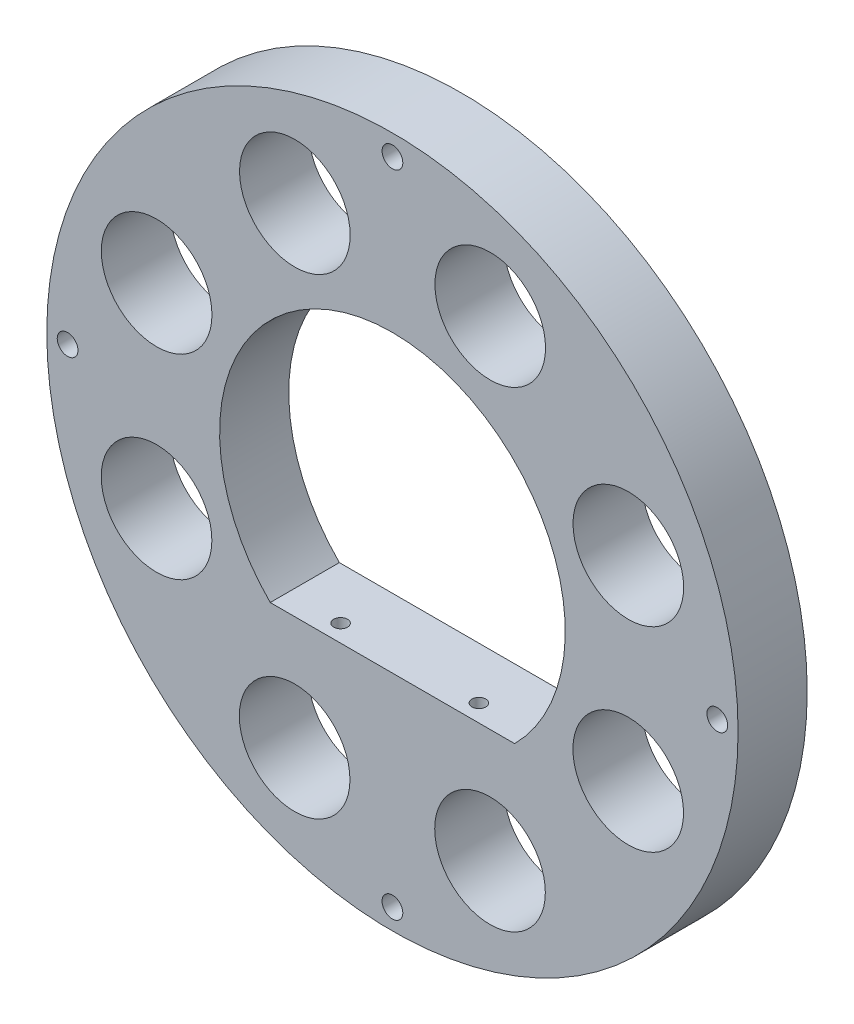
ISO-10303-21;
HEADER;
FILE_DESCRIPTION(('STEP AP214'),'2;1');
FILE_NAME('part.step','',(''),(''),'','','');
FILE_SCHEMA(('AUTOMOTIVE_DESIGN { 1 0 10303 214 1 1 1 1 }'));
ENDSEC;
DATA;
#1=APPLICATION_CONTEXT('core data for automotive mechanical design processes');
#2=APPLICATION_PROTOCOL_DEFINITION('international standard','automotive_design',2000,#1);
#3=PRODUCT_CONTEXT('',#1,'mechanical');
#4=PRODUCT('Part','Part','',(#3));
#5=PRODUCT_RELATED_PRODUCT_CATEGORY('part','',(#4));
#6=PRODUCT_DEFINITION_FORMATION('','',#4);
#7=PRODUCT_DEFINITION_CONTEXT('part definition',#1,'design');
#8=PRODUCT_DEFINITION('design','',#6,#7);
#9=PRODUCT_DEFINITION_SHAPE('','',#8);
#10=(LENGTH_UNIT() NAMED_UNIT(*) SI_UNIT(.MILLI.,.METRE.));
#11=(NAMED_UNIT(*) PLANE_ANGLE_UNIT() SI_UNIT($,.RADIAN.));
#12=(NAMED_UNIT(*) SI_UNIT($,.STERADIAN.) SOLID_ANGLE_UNIT());
#13=UNCERTAINTY_MEASURE_WITH_UNIT(LENGTH_MEASURE(1.E-05),#10,'distance_accuracy_value','');
#14=(GEOMETRIC_REPRESENTATION_CONTEXT(3) GLOBAL_UNCERTAINTY_ASSIGNED_CONTEXT((#13)) GLOBAL_UNIT_ASSIGNED_CONTEXT((#10,
#11,#12)) REPRESENTATION_CONTEXT('',''));
#15=CARTESIAN_POINT('',(0.,0.,0.));
#16=DIRECTION('',(0.,0.,1.));
#17=DIRECTION('',(1.,0.,0.));
#18=AXIS2_PLACEMENT_3D('',#15,#16,#17);
#19=CARTESIAN_POINT('',(0.,0.,10.));
#20=DIRECTION('',(0.,0.,1.));
#21=DIRECTION('',(1.,0.,0.));
#22=AXIS2_PLACEMENT_3D('',#19,#20,#21);
#23=PLANE('',#22);
#24=CARTESIAN_POINT('',(0.,46.99,10.));
#25=DIRECTION('',(0.,0.,1.));
#26=DIRECTION('',(1.,0.,0.));
#27=AXIS2_PLACEMENT_3D('',#24,#25,#26);
#28=CIRCLE('',#27,1.5);
#29=CARTESIAN_POINT('',(1.5,46.99,10.));
#30=VERTEX_POINT('',#29);
#31=EDGE_CURVE('E203',#30,#30,#28,.T.);
#32=ORIENTED_EDGE('',*,*,#31,.F.);
#33=EDGE_LOOP('',(#32));
#34=FACE_BOUND('',#33,.T.);
#35=CARTESIAN_POINT('',(-46.9900000000013,1.32978151082549E-12,10.));
#36=DIRECTION('',(0.,0.,1.));
#37=DIRECTION('',(1.,0.,0.));
#38=AXIS2_PLACEMENT_3D('',#35,#36,#37);
#39=CIRCLE('',#38,1.50000000000104);
#40=CARTESIAN_POINT('',(-45.4900000000003,1.32978151082549E-12,10.));
#41=VERTEX_POINT('',#40);
#42=EDGE_CURVE('E426',#41,#41,#39,.T.);
#43=ORIENTED_EDGE('',*,*,#42,.F.);
#44=EDGE_LOOP('',(#43));
#45=FACE_BOUND('',#44,.T.);
#46=CARTESIAN_POINT('',(-2.65956302165098E-12,-46.99,10.));
#47=DIRECTION('',(0.,0.,1.));
#48=DIRECTION('',(1.,0.,0.));
#49=AXIS2_PLACEMENT_3D('',#46,#47,#48);
#50=CIRCLE('',#49,1.50000000000286);
#51=CARTESIAN_POINT('',(1.5000000000002,-46.99,10.));
#52=VERTEX_POINT('',#51);
#53=EDGE_CURVE('E422',#52,#52,#50,.T.);
#54=ORIENTED_EDGE('',*,*,#53,.F.);
#55=EDGE_LOOP('',(#54));
#56=FACE_BOUND('',#55,.T.);
#57=CARTESIAN_POINT('',(46.9899999999987,-1.33553612613468E-12,10.));
#58=DIRECTION('',(0.,0.,1.));
#59=DIRECTION('',(1.,0.,0.));
#60=AXIS2_PLACEMENT_3D('',#57,#58,#59);
#61=CIRCLE('',#60,1.50000000000214);
#62=CARTESIAN_POINT('',(48.4900000000008,-1.33553612613468E-12,10.));
#63=VERTEX_POINT('',#62);
#64=EDGE_CURVE('E411',#63,#63,#61,.T.);
#65=ORIENTED_EDGE('',*,*,#64,.F.);
#66=EDGE_LOOP('',(#65));
#67=FACE_BOUND('',#66,.T.);
#68=CARTESIAN_POINT('',(34.1220261165839,14.1160551629816,10.));
#69=DIRECTION('',(0.,0.,1.));
#70=DIRECTION('',(1.,0.,0.));
#71=AXIS2_PLACEMENT_3D('',#68,#69,#70);
#72=CIRCLE('',#71,8.00000000000001);
#73=CARTESIAN_POINT('',(42.1220261165839,14.1160551629816,10.));
#74=VERTEX_POINT('',#73);
#75=EDGE_CURVE('E238',#74,#74,#72,.T.);
#76=ORIENTED_EDGE('',*,*,#75,.F.);
#77=EDGE_LOOP('',(#76));
#78=FACE_BOUND('',#77,.T.);
#79=CARTESIAN_POINT('',(34.1094743842074,-14.1463577255162,10.));
#80=DIRECTION('',(0.,0.,1.));
#81=DIRECTION('',(1.,0.,0.));
#82=AXIS2_PLACEMENT_3D('',#79,#80,#81);
#83=CIRCLE('',#82,8.);
#84=CARTESIAN_POINT('',(42.1094743842074,-14.1463577255162,10.));
#85=VERTEX_POINT('',#84);
#86=EDGE_CURVE('E188',#85,#85,#83,.T.);
#87=ORIENTED_EDGE('',*,*,#86,.F.);
#88=EDGE_LOOP('',(#87));
#89=FACE_BOUND('',#88,.T.);
#90=CARTESIAN_POINT('',(14.1160551629774,-34.1220261165881,10.));
#91=DIRECTION('',(0.,0.,1.));
#92=DIRECTION('',(1.,0.,0.));
#93=AXIS2_PLACEMENT_3D('',#90,#91,#92);
#94=CIRCLE('',#93,8.);
#95=CARTESIAN_POINT('',(22.1160551629774,-34.1220261165881,10.));
#96=VERTEX_POINT('',#95);
#97=EDGE_CURVE('E232',#96,#96,#94,.T.);
#98=ORIENTED_EDGE('',*,*,#97,.F.);
#99=EDGE_LOOP('',(#98));
#100=FACE_BOUND('',#99,.T.);
#101=CARTESIAN_POINT('',(-14.1463577255204,-34.1094743842116,10.));
#102=DIRECTION('',(0.,0.,1.));
#103=DIRECTION('',(1.,0.,0.));
#104=AXIS2_PLACEMENT_3D('',#101,#102,#103);
#105=CIRCLE('',#104,8.);
#106=CARTESIAN_POINT('',(-6.14635772552045,-34.1094743842116,10.));
#107=VERTEX_POINT('',#106);
#108=EDGE_CURVE('E228',#107,#107,#105,.T.);
#109=ORIENTED_EDGE('',*,*,#108,.F.);
#110=EDGE_LOOP('',(#109));
#111=FACE_BOUND('',#110,.T.);
#112=CARTESIAN_POINT('',(-34.1220261165923,-14.1160551629816,10.));
#113=DIRECTION('',(0.,0.,1.));
#114=DIRECTION('',(1.,0.,0.));
#115=AXIS2_PLACEMENT_3D('',#112,#113,#114);
#116=CIRCLE('',#115,8.);
#117=CARTESIAN_POINT('',(-26.1220261165923,-14.1160551629816,10.));
#118=VERTEX_POINT('',#117);
#119=EDGE_CURVE('E224',#118,#118,#116,.T.);
#120=ORIENTED_EDGE('',*,*,#119,.F.);
#121=EDGE_LOOP('',(#120));
#122=FACE_BOUND('',#121,.T.);
#123=CARTESIAN_POINT('',(-34.1094743842158,14.1463577255162,10.));
#124=DIRECTION('',(0.,0.,1.));
#125=DIRECTION('',(1.,0.,0.));
#126=AXIS2_PLACEMENT_3D('',#123,#124,#125);
#127=CIRCLE('',#126,8.);
#128=CARTESIAN_POINT('',(-26.1094743842158,14.1463577255162,10.));
#129=VERTEX_POINT('',#128);
#130=EDGE_CURVE('E220',#129,#129,#127,.T.);
#131=ORIENTED_EDGE('',*,*,#130,.F.);
#132=EDGE_LOOP('',(#131));
#133=FACE_BOUND('',#132,.T.);
#134=CARTESIAN_POINT('',(-14.1160551629858,34.1220261165881,10.));
#135=DIRECTION('',(0.,0.,1.));
#136=DIRECTION('',(1.,0.,0.));
#137=AXIS2_PLACEMENT_3D('',#134,#135,#136);
#138=CIRCLE('',#137,8.);
#139=CARTESIAN_POINT('',(-6.11605516298583,34.1220261165881,10.));
#140=VERTEX_POINT('',#139);
#141=EDGE_CURVE('E216',#140,#140,#138,.T.);
#142=ORIENTED_EDGE('',*,*,#141,.F.);
#143=EDGE_LOOP('',(#142));
#144=FACE_BOUND('',#143,.T.);
#145=CARTESIAN_POINT('',(14.146357725512,34.1094743842116,10.));
#146=DIRECTION('',(0.,0.,1.));
#147=DIRECTION('',(1.,0.,0.));
#148=AXIS2_PLACEMENT_3D('',#145,#146,#147);
#149=CIRCLE('',#148,8.);
#150=CARTESIAN_POINT('',(22.146357725512,34.1094743842116,10.));
#151=VERTEX_POINT('',#150);
#152=EDGE_CURVE('E211',#151,#151,#149,.T.);
#153=ORIENTED_EDGE('',*,*,#152,.F.);
#154=EDGE_LOOP('',(#153));
#155=FACE_BOUND('',#154,.T.);
#156=CARTESIAN_POINT('',(0.,0.,10.));
#157=DIRECTION('',(0.,0.,1.));
#158=DIRECTION('',(1.,0.,0.));
#159=AXIS2_PLACEMENT_3D('',#156,#157,#158);
#160=CIRCLE('',#159,50.);
#161=CARTESIAN_POINT('',(50.,0.,10.));
#162=VERTEX_POINT('',#161);
#163=EDGE_CURVE('E91',#162,#162,#160,.T.);
#164=ORIENTED_EDGE('',*,*,#163,.T.);
#165=EDGE_LOOP('',(#164));
#166=FACE_BOUND('',#165,.T.);
#167=DIRECTION('',(1.,0.,0.));
#168=VECTOR('',#167,1.);
#169=CARTESIAN_POINT('',(17.6776695296639,-17.6776695296635,10.));
#170=LINE('',#169,#168);
#171=CARTESIAN_POINT('',(-17.6776695296635,-17.6776695296638,10.));
#172=VERTEX_POINT('',#171);
#173=CARTESIAN_POINT('',(17.6776695296639,-17.6776695296635,10.));
#174=VERTEX_POINT('',#173);
#175=EDGE_CURVE('E247',#172,#174,#170,.T.);
#176=ORIENTED_EDGE('',*,*,#175,.F.);
#177=CARTESIAN_POINT('',(0.,0.,10.));
#178=DIRECTION('',(0.,0.,1.));
#179=DIRECTION('',(1.,0.,0.));
#180=AXIS2_PLACEMENT_3D('',#177,#178,#179);
#181=CIRCLE('',#180,25.);
#182=EDGE_CURVE('E243',#174,#172,#181,.T.);
#183=ORIENTED_EDGE('',*,*,#182,.F.);
#184=EDGE_LOOP('',(#176,#183));
#185=FACE_BOUND('',#184,.T.);
#186=ADVANCED_FACE('F39',(#34,#45,#56,#67,#78,#89,#100,#111,#122,#133,#144,#155,#166,#185),#23,.T.);
#187=CARTESIAN_POINT('',(0.,0.,0.));
#188=DIRECTION('',(0.,0.,1.));
#189=DIRECTION('',(1.,0.,0.));
#190=AXIS2_PLACEMENT_3D('',#187,#188,#189);
#191=PLANE('',#190);
#192=CARTESIAN_POINT('',(0.,46.99,0.));
#193=DIRECTION('',(0.,0.,-1.));
#194=DIRECTION('',(-1.,0.,0.));
#195=AXIS2_PLACEMENT_3D('',#192,#193,#194);
#196=CIRCLE('',#195,1.5);
#197=CARTESIAN_POINT('',(-1.5,46.99,0.));
#198=VERTEX_POINT('',#197);
#199=EDGE_CURVE('E407',#198,#198,#196,.T.);
#200=ORIENTED_EDGE('',*,*,#199,.F.);
#201=EDGE_LOOP('',(#200));
#202=FACE_BOUND('',#201,.T.);
#203=CARTESIAN_POINT('',(-46.9900000000013,1.32978151082549E-12,0.));
#204=DIRECTION('',(0.,0.,-1.));
#205=DIRECTION('',(-1.,0.,0.));
#206=AXIS2_PLACEMENT_3D('',#203,#204,#205);
#207=CIRCLE('',#206,1.50000000000104);
#208=CARTESIAN_POINT('',(-48.4900000000024,1.32978151082549E-12,0.));
#209=VERTEX_POINT('',#208);
#210=EDGE_CURVE('E412',#209,#209,#207,.T.);
#211=ORIENTED_EDGE('',*,*,#210,.F.);
#212=EDGE_LOOP('',(#211));
#213=FACE_BOUND('',#212,.T.);
#214=CARTESIAN_POINT('',(-2.65956302165098E-12,-46.99,0.));
#215=DIRECTION('',(0.,0.,-1.));
#216=DIRECTION('',(-1.,0.,0.));
#217=AXIS2_PLACEMENT_3D('',#214,#215,#216);
#218=CIRCLE('',#217,1.50000000000286);
#219=CARTESIAN_POINT('',(-1.50000000000552,-46.99,0.));
#220=VERTEX_POINT('',#219);
#221=EDGE_CURVE('E399',#220,#220,#218,.T.);
#222=ORIENTED_EDGE('',*,*,#221,.F.);
#223=EDGE_LOOP('',(#222));
#224=FACE_BOUND('',#223,.T.);
#225=CARTESIAN_POINT('',(46.9899999999987,-1.33553612613468E-12,0.));
#226=DIRECTION('',(0.,0.,-1.));
#227=DIRECTION('',(-1.,0.,0.));
#228=AXIS2_PLACEMENT_3D('',#225,#226,#227);
#229=CIRCLE('',#228,1.50000000000214);
#230=CARTESIAN_POINT('',(45.4899999999965,-1.33553612613468E-12,0.));
#231=VERTEX_POINT('',#230);
#232=EDGE_CURVE('E394',#231,#231,#229,.T.);
#233=ORIENTED_EDGE('',*,*,#232,.F.);
#234=EDGE_LOOP('',(#233));
#235=FACE_BOUND('',#234,.T.);
#236=CARTESIAN_POINT('',(34.1220261165839,14.1160551629816,0.));
#237=DIRECTION('',(0.,0.,-1.));
#238=DIRECTION('',(-1.,0.,0.));
#239=AXIS2_PLACEMENT_3D('',#236,#237,#238);
#240=CIRCLE('',#239,8.00000000000001);
#241=CARTESIAN_POINT('',(26.1220261165839,14.1160551629816,0.));
#242=VERTEX_POINT('',#241);
#243=EDGE_CURVE('E195',#242,#242,#240,.T.);
#244=ORIENTED_EDGE('',*,*,#243,.F.);
#245=EDGE_LOOP('',(#244));
#246=FACE_BOUND('',#245,.T.);
#247=CARTESIAN_POINT('',(34.1094743842074,-14.1463577255162,0.));
#248=DIRECTION('',(0.,0.,-1.));
#249=DIRECTION('',(-1.,0.,0.));
#250=AXIS2_PLACEMENT_3D('',#247,#248,#249);
#251=CIRCLE('',#250,8.);
#252=CARTESIAN_POINT('',(26.1094743842074,-14.1463577255162,0.));
#253=VERTEX_POINT('',#252);
#254=EDGE_CURVE('E191',#253,#253,#251,.T.);
#255=ORIENTED_EDGE('',*,*,#254,.F.);
#256=EDGE_LOOP('',(#255));
#257=FACE_BOUND('',#256,.T.);
#258=CARTESIAN_POINT('',(14.1160551629774,-34.1220261165881,0.));
#259=DIRECTION('',(0.,0.,-1.));
#260=DIRECTION('',(-1.,0.,0.));
#261=AXIS2_PLACEMENT_3D('',#258,#259,#260);
#262=CIRCLE('',#261,8.);
#263=CARTESIAN_POINT('',(6.1160551629774,-34.1220261165881,0.));
#264=VERTEX_POINT('',#263);
#265=EDGE_CURVE('E194',#264,#264,#262,.T.);
#266=ORIENTED_EDGE('',*,*,#265,.F.);
#267=EDGE_LOOP('',(#266));
#268=FACE_BOUND('',#267,.T.);
#269=CARTESIAN_POINT('',(-14.1463577255204,-34.1094743842116,0.));
#270=DIRECTION('',(0.,0.,-1.));
#271=DIRECTION('',(-1.,0.,0.));
#272=AXIS2_PLACEMENT_3D('',#269,#270,#271);
#273=CIRCLE('',#272,8.);
#274=CARTESIAN_POINT('',(-22.1463577255204,-34.1094743842116,0.));
#275=VERTEX_POINT('',#274);
#276=EDGE_CURVE('E200',#275,#275,#273,.T.);
#277=ORIENTED_EDGE('',*,*,#276,.F.);
#278=EDGE_LOOP('',(#277));
#279=FACE_BOUND('',#278,.T.);
#280=CARTESIAN_POINT('',(-34.1220261165923,-14.1160551629816,0.));
#281=DIRECTION('',(0.,0.,-1.));
#282=DIRECTION('',(-1.,0.,0.));
#283=AXIS2_PLACEMENT_3D('',#280,#281,#282);
#284=CIRCLE('',#283,8.);
#285=CARTESIAN_POINT('',(-42.1220261165923,-14.1160551629816,0.));
#286=VERTEX_POINT('',#285);
#287=EDGE_CURVE('E440',#286,#286,#284,.T.);
#288=ORIENTED_EDGE('',*,*,#287,.F.);
#289=EDGE_LOOP('',(#288));
#290=FACE_BOUND('',#289,.T.);
#291=CARTESIAN_POINT('',(-34.1094743842158,14.1463577255162,0.));
#292=DIRECTION('',(0.,0.,-1.));
#293=DIRECTION('',(-1.,0.,0.));
#294=AXIS2_PLACEMENT_3D('',#291,#292,#293);
#295=CIRCLE('',#294,8.);
#296=CARTESIAN_POINT('',(-42.1094743842158,14.1463577255162,0.));
#297=VERTEX_POINT('',#296);
#298=EDGE_CURVE('E436',#297,#297,#295,.T.);
#299=ORIENTED_EDGE('',*,*,#298,.F.);
#300=EDGE_LOOP('',(#299));
#301=FACE_BOUND('',#300,.T.);
#302=CARTESIAN_POINT('',(-14.1160551629858,34.1220261165881,0.));
#303=DIRECTION('',(0.,0.,-1.));
#304=DIRECTION('',(-1.,0.,0.));
#305=AXIS2_PLACEMENT_3D('',#302,#303,#304);
#306=CIRCLE('',#305,8.);
#307=CARTESIAN_POINT('',(-22.1160551629858,34.1220261165881,0.));
#308=VERTEX_POINT('',#307);
#309=EDGE_CURVE('E212',#308,#308,#306,.T.);
#310=ORIENTED_EDGE('',*,*,#309,.F.);
#311=EDGE_LOOP('',(#310));
#312=FACE_BOUND('',#311,.T.);
#313=CARTESIAN_POINT('',(14.146357725512,34.1094743842116,0.));
#314=DIRECTION('',(0.,0.,-1.));
#315=DIRECTION('',(-1.,0.,0.));
#316=AXIS2_PLACEMENT_3D('',#313,#314,#315);
#317=CIRCLE('',#316,8.);
#318=CARTESIAN_POINT('',(6.14635772551202,34.1094743842116,0.));
#319=VERTEX_POINT('',#318);
#320=EDGE_CURVE('E207',#319,#319,#317,.T.);
#321=ORIENTED_EDGE('',*,*,#320,.F.);
#322=EDGE_LOOP('',(#321));
#323=FACE_BOUND('',#322,.T.);
#324=CARTESIAN_POINT('',(0.,0.,0.));
#325=DIRECTION('',(0.,0.,1.));
#326=DIRECTION('',(1.,0.,0.));
#327=AXIS2_PLACEMENT_3D('',#324,#325,#326);
#328=CIRCLE('',#327,50.);
#329=CARTESIAN_POINT('',(50.,0.,0.));
#330=VERTEX_POINT('',#329);
#331=EDGE_CURVE('E265',#330,#330,#328,.T.);
#332=ORIENTED_EDGE('',*,*,#331,.F.);
#333=EDGE_LOOP('',(#332));
#334=FACE_BOUND('',#333,.T.);
#335=CARTESIAN_POINT('',(0.,0.,0.));
#336=DIRECTION('',(0.,0.,1.));
#337=DIRECTION('',(1.,0.,0.));
#338=AXIS2_PLACEMENT_3D('',#335,#336,#337);
#339=CIRCLE('',#338,25.);
#340=CARTESIAN_POINT('',(17.6776695296639,-17.6776695296635,0.));
#341=VERTEX_POINT('',#340);
#342=CARTESIAN_POINT('',(-17.6776695296635,-17.6776695296638,0.));
#343=VERTEX_POINT('',#342);
#344=EDGE_CURVE('E242',#341,#343,#339,.T.);
#345=ORIENTED_EDGE('',*,*,#344,.T.);
#346=DIRECTION('',(1.,0.,0.));
#347=VECTOR('',#346,1.);
#348=CARTESIAN_POINT('',(17.6776695296639,-17.6776695296635,0.));
#349=LINE('',#348,#347);
#350=EDGE_CURVE('E248',#343,#341,#349,.T.);
#351=ORIENTED_EDGE('',*,*,#350,.T.);
#352=EDGE_LOOP('',(#345,#351));
#353=FACE_BOUND('',#352,.T.);
#354=ADVANCED_FACE('F158',(#202,#213,#224,#235,#246,#257,#268,#279,#290,#301,#312,#323,#334,
#353),#191,.F.);
#355=CARTESIAN_POINT('',(0.,0.,10.));
#356=DIRECTION('',(0.,0.,-1.));
#357=DIRECTION('',(-1.,0.,0.));
#358=AXIS2_PLACEMENT_3D('',#355,#356,#357);
#359=CYLINDRICAL_SURFACE('',#358,50.);
#360=ORIENTED_EDGE('',*,*,#163,.F.);
#361=EDGE_LOOP('',(#360));
#362=FACE_BOUND('',#361,.T.);
#363=ORIENTED_EDGE('',*,*,#331,.T.);
#364=EDGE_LOOP('',(#363));
#365=FACE_BOUND('',#364,.T.);
#366=ADVANCED_FACE('F41',(#362,#365),#359,.T.);
#367=CARTESIAN_POINT('',(0.,0.,10.));
#368=DIRECTION('',(0.,0.,-1.));
#369=DIRECTION('',(-1.,0.,0.));
#370=AXIS2_PLACEMENT_3D('',#367,#368,#369);
#371=CYLINDRICAL_SURFACE('',#370,25.);
#372=ORIENTED_EDGE('',*,*,#344,.F.);
#373=DIRECTION('',(0.,0.,-1.));
#374=VECTOR('',#373,1.);
#375=CARTESIAN_POINT('',(17.6776695296639,-17.6776695296635,10.));
#376=LINE('',#375,#374);
#377=EDGE_CURVE('E251',#174,#341,#376,.T.);
#378=ORIENTED_EDGE('',*,*,#377,.F.);
#379=ORIENTED_EDGE('',*,*,#182,.T.);
#380=DIRECTION('',(0.,0.,-1.));
#381=VECTOR('',#380,1.);
#382=CARTESIAN_POINT('',(-17.6776695296635,-17.6776695296638,10.));
#383=LINE('',#382,#381);
#384=EDGE_CURVE('E261',#172,#343,#383,.T.);
#385=ORIENTED_EDGE('',*,*,#384,.T.);
#386=EDGE_LOOP('',(#372,#378,#379,#385));
#387=FACE_BOUND('',#386,.T.);
#388=ADVANCED_FACE('F168',(#387),#371,.F.);
#389=CARTESIAN_POINT('',(17.6776695296639,-17.6776695296635,10.));
#390=DIRECTION('',(0.,1.,0.));
#391=DIRECTION('',(-1.,0.,0.));
#392=AXIS2_PLACEMENT_3D('',#389,#390,#391);
#393=PLANE('',#392);
#394=CARTESIAN_POINT('',(-9.99999999999982,-17.6776695296638,7.5));
#395=DIRECTION('',(0.,1.,0.));
#396=DIRECTION('',(-1.,0.,0.));
#397=AXIS2_PLACEMENT_3D('',#394,#395,#396);
#398=CIRCLE('',#397,1.);
#399=CARTESIAN_POINT('',(-10.9999999999998,-17.6776695296638,7.5));
#400=VERTEX_POINT('',#399);
#401=EDGE_CURVE('E96',#400,#400,#398,.T.);
#402=ORIENTED_EDGE('',*,*,#401,.F.);
#403=EDGE_LOOP('',(#402));
#404=FACE_BOUND('',#403,.T.);
#405=CARTESIAN_POINT('',(10.0000000000002,-17.6776695296636,7.5));
#406=DIRECTION('',(0.,1.,0.));
#407=DIRECTION('',(-1.,0.,0.));
#408=AXIS2_PLACEMENT_3D('',#405,#406,#407);
#409=CIRCLE('',#408,1.);
#410=CARTESIAN_POINT('',(9.00000000000019,-17.6776695296636,7.5));
#411=VERTEX_POINT('',#410);
#412=EDGE_CURVE('E97',#411,#411,#409,.T.);
#413=ORIENTED_EDGE('',*,*,#412,.F.);
#414=EDGE_LOOP('',(#413));
#415=FACE_BOUND('',#414,.T.);
#416=ORIENTED_EDGE('',*,*,#350,.F.);
#417=ORIENTED_EDGE('',*,*,#384,.F.);
#418=ORIENTED_EDGE('',*,*,#175,.T.);
#419=ORIENTED_EDGE('',*,*,#377,.T.);
#420=EDGE_LOOP('',(#416,#417,#418,#419));
#421=FACE_BOUND('',#420,.T.);
#422=ADVANCED_FACE('F171',(#404,#415,#421),#393,.T.);
#423=CARTESIAN_POINT('',(14.146357725512,34.1094743842116,20.));
#424=DIRECTION('',(0.,0.,-1.));
#425=DIRECTION('',(-1.,0.,0.));
#426=AXIS2_PLACEMENT_3D('',#423,#424,#425);
#427=CYLINDRICAL_SURFACE('',#426,8.);
#428=ORIENTED_EDGE('',*,*,#152,.T.);
#429=EDGE_LOOP('',(#428));
#430=FACE_BOUND('',#429,.T.);
#431=ORIENTED_EDGE('',*,*,#320,.T.);
#432=EDGE_LOOP('',(#431));
#433=FACE_BOUND('',#432,.T.);
#434=ADVANCED_FACE('F139',(#430,#433),#427,.F.);
#435=CARTESIAN_POINT('',(-14.1160551629858,34.1220261165881,20.));
#436=DIRECTION('',(0.,0.,-1.));
#437=DIRECTION('',(-1.,0.,0.));
#438=AXIS2_PLACEMENT_3D('',#435,#436,#437);
#439=CYLINDRICAL_SURFACE('',#438,8.);
#440=ORIENTED_EDGE('',*,*,#141,.T.);
#441=EDGE_LOOP('',(#440));
#442=FACE_BOUND('',#441,.T.);
#443=ORIENTED_EDGE('',*,*,#309,.T.);
#444=EDGE_LOOP('',(#443));
#445=FACE_BOUND('',#444,.T.);
#446=ADVANCED_FACE('F135',(#442,#445),#439,.F.);
#447=CARTESIAN_POINT('',(-34.1094743842158,14.1463577255162,20.));
#448=DIRECTION('',(0.,0.,-1.));
#449=DIRECTION('',(-1.,0.,0.));
#450=AXIS2_PLACEMENT_3D('',#447,#448,#449);
#451=CYLINDRICAL_SURFACE('',#450,8.);
#452=ORIENTED_EDGE('',*,*,#130,.T.);
#453=EDGE_LOOP('',(#452));
#454=FACE_BOUND('',#453,.T.);
#455=ORIENTED_EDGE('',*,*,#298,.T.);
#456=EDGE_LOOP('',(#455));
#457=FACE_BOUND('',#456,.T.);
#458=ADVANCED_FACE('F138',(#454,#457),#451,.F.);
#459=CARTESIAN_POINT('',(-34.1220261165923,-14.1160551629816,20.));
#460=DIRECTION('',(0.,0.,-1.));
#461=DIRECTION('',(-1.,0.,0.));
#462=AXIS2_PLACEMENT_3D('',#459,#460,#461);
#463=CYLINDRICAL_SURFACE('',#462,8.);
#464=ORIENTED_EDGE('',*,*,#119,.T.);
#465=EDGE_LOOP('',(#464));
#466=FACE_BOUND('',#465,.T.);
#467=ORIENTED_EDGE('',*,*,#287,.T.);
#468=EDGE_LOOP('',(#467));
#469=FACE_BOUND('',#468,.T.);
#470=ADVANCED_FACE('F143',(#466,#469),#463,.F.);
#471=CARTESIAN_POINT('',(-14.1463577255204,-34.1094743842116,20.));
#472=DIRECTION('',(0.,0.,-1.));
#473=DIRECTION('',(-1.,0.,0.));
#474=AXIS2_PLACEMENT_3D('',#471,#472,#473);
#475=CYLINDRICAL_SURFACE('',#474,8.);
#476=DIRECTION('',(0.,0.,-1.));
#477=VECTOR('',#476,1.);
#478=CARTESIAN_POINT('',(-9.38905950982964,-27.6776695296638,20.));
#479=LINE('',#478,#477);
#480=CARTESIAN_POINT('',(-9.38905950982964,-27.6776695296638,6.7083234767465));
#481=VERTEX_POINT('',#480);
#482=CARTESIAN_POINT('',(-9.38905950982964,-27.6776695296638,8.2916765232535));
#483=VERTEX_POINT('',#482);
#484=EDGE_CURVE('E54',#481,#483,#479,.F.);
#485=ORIENTED_EDGE('',*,*,#484,.F.);
#486=CARTESIAN_POINT('',(-9.38905950982964,-27.6776695296638,6.7083234767465));
#487=CARTESIAN_POINT('',(-9.41821903567815,-27.6560996187148,6.68583312211024));
#488=CARTESIAN_POINT('',(-9.44837586412962,-27.6341034123025,6.66511860542842));
#489=CARTESIAN_POINT('',(-9.51044037231122,-27.5895259889733,6.6272700895319));
#490=CARTESIAN_POINT('',(-9.54234760024166,-27.5669449238025,6.61013517181761));
#491=CARTESIAN_POINT('',(-9.64032977153793,-27.4987245661391,6.56413788210829));
#492=CARTESIAN_POINT('',(-9.70868605567989,-27.4525925631948,6.54066711389186));
#493=CARTESIAN_POINT('',(-9.84269069275479,-27.3652721764196,6.51028682349037));
#494=CARTESIAN_POINT('',(-9.9080053931847,-27.3240209584812,6.50204711496094));
#495=CARTESIAN_POINT('',(-10.0400851377798,-27.2432892651295,6.49862664502071));
#496=CARTESIAN_POINT('',(-10.1068495177836,-27.2038080032111,6.50344002362484));
#497=CARTESIAN_POINT('',(-10.2387797682299,-27.1283188627975,6.52665102874646));
#498=CARTESIAN_POINT('',(-10.3039549794063,-27.0922705306948,6.5448600473033));
#499=CARTESIAN_POINT('',(-10.4310281306545,-27.0241720107375,6.59508623090218));
#500=CARTESIAN_POINT('',(-10.4929286364826,-26.9921186652566,6.62709240034));
#501=CARTESIAN_POINT('',(-10.6033613237274,-26.9365706225008,6.70012051520612));
#502=CARTESIAN_POINT('',(-10.6526087813244,-26.9125120924912,6.73962919873374));
#503=CARTESIAN_POINT('',(-10.7437128631981,-26.8689939495544,6.82848886230293));
#504=CARTESIAN_POINT('',(-10.7855765691441,-26.8495299239618,6.87783031402376));
#505=CARTESIAN_POINT('',(-10.8548771640959,-26.8178746680535,6.97806392101742));
#506=CARTESIAN_POINT('',(-10.8834700308615,-26.8050743465884,7.0279670375965));
#507=CARTESIAN_POINT('',(-10.931879494112,-26.7836409763436,7.13268434031891));
#508=CARTESIAN_POINT('',(-10.9517012197712,-26.7750054917907,7.18749563365659));
#509=CARTESIAN_POINT('',(-10.98032495618,-26.7626070411144,7.29549585662755));
#510=CARTESIAN_POINT('',(-10.9899073311059,-26.7584981314804,7.3484396359157));
#511=CARTESIAN_POINT('',(-11.0004428630564,-26.7539829380857,7.45533063662947));
#512=CARTESIAN_POINT('',(-11.0013983222155,-26.7535756665246,7.50927758650332));
#513=CARTESIAN_POINT('',(-10.994759397098,-26.7564179761019,7.61464875336131));
#514=CARTESIAN_POINT('',(-10.9874612562588,-26.7595408493094,7.66609544898436));
#515=CARTESIAN_POINT('',(-10.9650976182694,-26.7691929924207,7.76693323542942));
#516=CARTESIAN_POINT('',(-10.9500324677506,-26.7757221103085,7.81632441787993));
#517=CARTESIAN_POINT('',(-10.9126378210036,-26.7921338937407,7.91200207793572));
#518=CARTESIAN_POINT('',(-10.8902676031806,-26.8020353718941,7.95826935516634));
#519=CARTESIAN_POINT('',(-10.8391593199355,-26.8250237415505,8.04626163886093));
#520=CARTESIAN_POINT('',(-10.8104204425074,-26.8381110392673,8.08798606509747));
#521=CARTESIAN_POINT('',(-10.7462609340103,-26.8678832803507,8.16770008570527));
#522=CARTESIAN_POINT('',(-10.7106061418017,-26.8846987146236,8.20545196181454));
#523=CARTESIAN_POINT('',(-10.6347657403208,-26.9212553151383,8.27440428135784));
#524=CARTESIAN_POINT('',(-10.5945787767521,-26.9409973564614,8.30560275850074));
#525=CARTESIAN_POINT('',(-10.5075631166489,-26.9847479469259,8.36331887892957));
#526=CARTESIAN_POINT('',(-10.4604602011579,-27.0089718990173,8.38925858727274));
#527=CARTESIAN_POINT('',(-10.363896908119,-27.0599371633851,8.432947591796));
#528=CARTESIAN_POINT('',(-10.3144357419508,-27.0866793207284,8.45069412660831));
#529=CARTESIAN_POINT('',(-10.2088299385891,-27.1452865749457,8.479649506704));
#530=CARTESIAN_POINT('',(-10.1525566673271,-27.177390090998,8.48990477807024));
#531=CARTESIAN_POINT('',(-10.0401136007289,-27.2433969140438,8.50079313343905));
#532=CARTESIAN_POINT('',(-9.98394393369483,-27.2773017249494,8.50141804617122));
#533=CARTESIAN_POINT('',(-9.86622317720011,-27.3503469319004,8.49297297739879));
#534=CARTESIAN_POINT('',(-9.80484198116178,-27.3896249156363,8.48272236630711));
#535=CARTESIAN_POINT('',(-9.68521465052677,-27.4684407339458,8.45117467572132));
#536=CARTESIAN_POINT('',(-9.62696615687778,-27.5079783470992,8.42988604059682));
#537=CARTESIAN_POINT('',(-9.53900511983313,-27.5693042133331,8.38810827803833));
#538=CARTESIAN_POINT('',(-9.50778108046519,-27.59142261956,8.37120254064929));
#539=CARTESIAN_POINT('',(-9.44707211317369,-27.6350541575472,8.33398606225673));
#540=CARTESIAN_POINT('',(-9.41758470424306,-27.6565681286367,8.31368034633376));
#541=CARTESIAN_POINT('',(-9.38905950982964,-27.6776695296638,8.2916765232535));
#542=B_SPLINE_CURVE_WITH_KNOTS('',3,(#486,#487,#488,#489,#490,#491,#492,#493,#494,#495,#496,
#497,#498,#499,#500,#501,#502,#503,#504,#505,#506,#507,#508,#509,#510,#511,#512,#513,#514,#515,
#516,#517,#518,#519,#520,#521,#522,#523,#524,#525,#526,#527,#528,#529,#530,#531,#532,#533,#534,
#535,#536,#537,#538,#539,#540,#541),.UNSPECIFIED.,.F.,.F.,(4,2,2,2,2,2,2,2,2,2,2,2,2,2,2,2,2,2,
2,2,2,2,2,2,2,2,2,4),(0.,0.127910741980842,0.255788622554189,0.511454367264673,
0.743490008570784,0.975421498249407,1.204148466831,1.43269348805695,1.63421854354471,
1.8355492550906,2.01136432302783,2.18707644179238,2.3481525903474,2.50918575367714,
2.66461750682681,2.82004232386624,2.97634877391858,3.13267516456847,3.29572299288016,
3.45881967263474,3.6350280464193,3.81129576491959,4.00728434010848,4.20343920064708,
4.42329688461278,4.64298661947809,4.7683239002938,4.8934775450588),.UNSPECIFIED.);
#543=EDGE_CURVE('E11',#481,#483,#542,.T.);
#544=ORIENTED_EDGE('',*,*,#543,.T.);
#545=EDGE_LOOP('',(#485,#544));
#546=FACE_BOUND('',#545,.T.);
#547=ORIENTED_EDGE('',*,*,#108,.T.);
#548=EDGE_LOOP('',(#547));
#549=FACE_BOUND('',#548,.T.);
#550=ORIENTED_EDGE('',*,*,#276,.T.);
#551=EDGE_LOOP('',(#550));
#552=FACE_BOUND('',#551,.T.);
#553=ADVANCED_FACE('F146',(#546,#549,#552),#475,.F.);
#554=CARTESIAN_POINT('',(14.1160551629774,-34.1220261165881,20.));
#555=DIRECTION('',(0.,0.,-1.));
#556=DIRECTION('',(-1.,0.,0.));
#557=AXIS2_PLACEMENT_3D('',#554,#555,#556);
#558=CYLINDRICAL_SURFACE('',#557,8.);
#559=DIRECTION('',(0.,0.,-1.));
#560=VECTOR('',#559,1.);
#561=CARTESIAN_POINT('',(9.37577371768722,-27.6776695296636,20.));
#562=LINE('',#561,#560);
#563=CARTESIAN_POINT('',(9.37577371768722,-27.6776695296636,8.28124359099425));
#564=VERTEX_POINT('',#563);
#565=CARTESIAN_POINT('',(9.37577371768722,-27.6776695296636,6.71875640900574));
#566=VERTEX_POINT('',#565);
#567=EDGE_CURVE('E85',#564,#566,#562,.T.);
#568=ORIENTED_EDGE('',*,*,#567,.F.);
#569=CARTESIAN_POINT('',(9.37577371768722,-27.6776695296636,8.28124359099425));
#570=CARTESIAN_POINT('',(9.40470666954889,-27.6563852756973,8.30434897742049));
#571=CARTESIAN_POINT('',(9.4346706699567,-27.6346474833652,8.32567049598301));
#572=CARTESIAN_POINT('',(9.49640810001104,-27.5905410514164,8.36471626511856));
#573=CARTESIAN_POINT('',(9.52818098015432,-27.5681726044119,8.38244160075499));
#574=CARTESIAN_POINT('',(9.6258119268968,-27.5005498425649,8.43017419160786));
#575=CARTESIAN_POINT('',(9.69402701933045,-27.4547449354708,8.45477321643919));
#576=CARTESIAN_POINT('',(9.82735297955512,-27.368307238456,8.48712649830011));
#577=CARTESIAN_POINT('',(9.8920868162722,-27.3276172979204,8.49632521632699));
#578=CARTESIAN_POINT('',(10.0231341724004,-27.2478815457171,8.50187710687457));
#579=CARTESIAN_POINT('',(10.0894471256789,-27.2088351583068,8.49823481618757));
#580=CARTESIAN_POINT('',(10.2211294135703,-27.1338033794927,8.47750363546033));
#581=CARTESIAN_POINT('',(10.2865021034316,-27.0977985789081,8.46050848937783));
#582=CARTESIAN_POINT('',(10.4141973242583,-27.0296729811684,8.41272943739864));
#583=CARTESIAN_POINT('',(10.4765221302338,-26.9975492599114,8.38195599572421));
#584=CARTESIAN_POINT('',(10.588252112967,-26.9416315468828,8.31106472420486));
#585=CARTESIAN_POINT('',(10.6383199854836,-26.9173053156683,8.2724142134835));
#586=CARTESIAN_POINT('',(10.7312194120304,-26.8731964795043,8.18510486365651));
#587=CARTESIAN_POINT('',(10.7740578027351,-26.8534095754304,8.13645557773303));
#588=CARTESIAN_POINT('',(10.8453454508498,-26.8210808974558,8.0372558686469));
#589=CARTESIAN_POINT('',(10.8749259467639,-26.8079414346889,7.98771073334246));
#590=CARTESIAN_POINT('',(10.9253450854911,-26.7858055692555,7.88350922608989));
#591=CARTESIAN_POINT('',(10.9461888548614,-26.7768067366363,7.8288558746453));
#592=CARTESIAN_POINT('',(10.9767498450318,-26.763696423734,7.72098973487843));
#593=CARTESIAN_POINT('',(10.9872535861377,-26.7592383603186,7.66804052274492));
#594=CARTESIAN_POINT('',(10.9995921191548,-26.7540070440914,7.56096634347219));
#595=CARTESIAN_POINT('',(11.0014292771937,-26.7532327855365,7.50684170130028));
#596=CARTESIAN_POINT('',(10.9964488148692,-26.7553402017223,7.40103446523068));
#597=CARTESIAN_POINT('',(10.9899412961165,-26.7580908816591,7.34933425919722));
#598=CARTESIAN_POINT('',(10.9690741116109,-26.7669844796646,7.24785234439151));
#599=CARTESIAN_POINT('',(10.9547148664678,-26.773127216024,7.19807053300554));
#600=CARTESIAN_POINT('',(10.9186584981559,-26.7887431547689,7.10159220853331));
#601=CARTESIAN_POINT('',(10.8969346337067,-26.7982284993508,7.05490769122679));
#602=CARTESIAN_POINT('',(10.8470081175182,-26.8203773636706,6.96597858669637));
#603=CARTESIAN_POINT('',(10.8188047129143,-26.8330412527428,6.92373451624465));
#604=CARTESIAN_POINT('',(10.7556962688342,-26.8619134350452,6.84299717596542));
#605=CARTESIAN_POINT('',(10.7205673897248,-26.8782437546606,6.80472297535654));
#606=CARTESIAN_POINT('',(10.6456577897738,-26.9138321030503,6.73465087109059));
#607=CARTESIAN_POINT('',(10.6058757400967,-26.9330909686216,6.70285482458397));
#608=CARTESIAN_POINT('',(10.5197124155053,-26.9757823459991,6.64394639547366));
#609=CARTESIAN_POINT('',(10.4730588453283,-26.9994221009115,6.61738363551022));
#610=CARTESIAN_POINT('',(10.377269586523,-27.0492331293399,6.57238390411664));
#611=CARTESIAN_POINT('',(10.3281330683813,-27.0754052515867,6.55394966857033));
#612=CARTESIAN_POINT('',(10.2232405755183,-27.132752966338,6.52354708700599));
#613=CARTESIAN_POINT('',(10.167346142645,-27.1641631105043,6.51250067061818));
#614=CARTESIAN_POINT('',(10.0555307633086,-27.2288176826223,6.49995665278561));
#615=CARTESIAN_POINT('',(9.9996098304801,-27.2620635312518,6.49846655461601));
#616=CARTESIAN_POINT('',(9.88236057757126,-27.3337206053811,6.50500822959124));
#617=CARTESIAN_POINT('',(9.82118385022114,-27.3722746100616,6.51419816477903));
#618=CARTESIAN_POINT('',(9.70179313398061,-27.4497436328538,6.54352249148757));
#619=CARTESIAN_POINT('',(9.64357760448619,-27.488658450526,6.56365112697086));
#620=CARTESIAN_POINT('',(9.55002355208911,-27.5528994130679,6.6060112892537));
#621=CARTESIAN_POINT('',(9.51350035455441,-27.5784525096011,6.62533213735796));
#622=CARTESIAN_POINT('',(9.44279822888139,-27.628755148531,6.66859419160144));
#623=CARTESIAN_POINT('',(9.40861638949921,-27.6535056679071,6.69252951338507));
#624=CARTESIAN_POINT('',(9.37577371768721,-27.6776695296636,6.71875640900575));
#625=B_SPLINE_CURVE_WITH_KNOTS('',3,(#569,#570,#571,#572,#573,#574,#575,#576,#577,#578,#579,
#580,#581,#582,#583,#584,#585,#586,#587,#588,#589,#590,#591,#592,#593,#594,#595,#596,#597,#598,
#599,#600,#601,#602,#603,#604,#605,#606,#607,#608,#609,#610,#611,#612,#613,#614,#615,#616,#617,
#618,#619,#620,#621,#622,#623,#624),.UNSPECIFIED.,.F.,.F.,(4,2,2,2,2,2,2,2,2,2,2,2,2,2,2,2,2,2,
2,2,2,2,2,2,2,2,2,4),(0.,0.127999566009894,0.255960453543684,0.511687672031777,
0.741713915383618,0.971658897464363,1.20000381703357,1.42817560854896,1.63030615616422,
1.83224447148784,2.00883299350986,2.18531775094617,2.34700176246172,2.50864162887979,
2.66444519009157,2.8202404058672,2.97660749070825,3.13299275320188,3.29566511735135,
3.45838405082843,3.63364018384054,3.80895525929849,4.00334840807389,4.19789416864607,
4.41566883546963,4.63332901820965,4.77881246228372,4.92411159919836),.UNSPECIFIED.);
#626=EDGE_CURVE('E90',#564,#566,#625,.T.);
#627=ORIENTED_EDGE('',*,*,#626,.T.);
#628=EDGE_LOOP('',(#568,#627));
#629=FACE_BOUND('',#628,.T.);
#630=ORIENTED_EDGE('',*,*,#97,.T.);
#631=EDGE_LOOP('',(#630));
#632=FACE_BOUND('',#631,.T.);
#633=ORIENTED_EDGE('',*,*,#265,.T.);
#634=EDGE_LOOP('',(#633));
#635=FACE_BOUND('',#634,.T.);
#636=ADVANCED_FACE('F99',(#629,#632,#635),#558,.F.);
#637=CARTESIAN_POINT('',(34.1094743842074,-14.1463577255162,20.));
#638=DIRECTION('',(0.,0.,-1.));
#639=DIRECTION('',(-1.,0.,0.));
#640=AXIS2_PLACEMENT_3D('',#637,#638,#639);
#641=CYLINDRICAL_SURFACE('',#640,8.);
#642=ORIENTED_EDGE('',*,*,#86,.T.);
#643=EDGE_LOOP('',(#642));
#644=FACE_BOUND('',#643,.T.);
#645=ORIENTED_EDGE('',*,*,#254,.T.);
#646=EDGE_LOOP('',(#645));
#647=FACE_BOUND('',#646,.T.);
#648=ADVANCED_FACE('F154',(#644,#647),#641,.F.);
#649=CARTESIAN_POINT('',(34.1220261165839,14.1160551629816,20.));
#650=DIRECTION('',(0.,0.,-1.));
#651=DIRECTION('',(-1.,0.,0.));
#652=AXIS2_PLACEMENT_3D('',#649,#650,#651);
#653=CYLINDRICAL_SURFACE('',#652,8.00000000000001);
#654=ORIENTED_EDGE('',*,*,#75,.T.);
#655=EDGE_LOOP('',(#654));
#656=FACE_BOUND('',#655,.T.);
#657=ORIENTED_EDGE('',*,*,#243,.T.);
#658=EDGE_LOOP('',(#657));
#659=FACE_BOUND('',#658,.T.);
#660=ADVANCED_FACE('F133',(#656,#659),#653,.F.);
#661=CARTESIAN_POINT('',(46.9899999999987,-1.33553612613468E-12,30.));
#662=DIRECTION('',(0.,0.,-1.));
#663=DIRECTION('',(-1.,0.,0.));
#664=AXIS2_PLACEMENT_3D('',#661,#662,#663);
#665=CYLINDRICAL_SURFACE('',#664,1.50000000000214);
#666=ORIENTED_EDGE('',*,*,#64,.T.);
#667=EDGE_LOOP('',(#666));
#668=FACE_BOUND('',#667,.T.);
#669=ORIENTED_EDGE('',*,*,#232,.T.);
#670=EDGE_LOOP('',(#669));
#671=FACE_BOUND('',#670,.T.);
#672=ADVANCED_FACE('F129',(#668,#671),#665,.F.);
#673=CARTESIAN_POINT('',(-2.65956302165098E-12,-46.99,30.));
#674=DIRECTION('',(0.,0.,-1.));
#675=DIRECTION('',(-1.,0.,0.));
#676=AXIS2_PLACEMENT_3D('',#673,#674,#675);
#677=CYLINDRICAL_SURFACE('',#676,1.50000000000286);
#678=ORIENTED_EDGE('',*,*,#53,.T.);
#679=EDGE_LOOP('',(#678));
#680=FACE_BOUND('',#679,.T.);
#681=ORIENTED_EDGE('',*,*,#221,.T.);
#682=EDGE_LOOP('',(#681));
#683=FACE_BOUND('',#682,.T.);
#684=ADVANCED_FACE('F125',(#680,#683),#677,.F.);
#685=CARTESIAN_POINT('',(-46.9900000000013,1.32978151082549E-12,30.));
#686=DIRECTION('',(0.,0.,-1.));
#687=DIRECTION('',(-1.,0.,0.));
#688=AXIS2_PLACEMENT_3D('',#685,#686,#687);
#689=CYLINDRICAL_SURFACE('',#688,1.50000000000104);
#690=ORIENTED_EDGE('',*,*,#42,.T.);
#691=EDGE_LOOP('',(#690));
#692=FACE_BOUND('',#691,.T.);
#693=ORIENTED_EDGE('',*,*,#210,.T.);
#694=EDGE_LOOP('',(#693));
#695=FACE_BOUND('',#694,.T.);
#696=ADVANCED_FACE('F121',(#692,#695),#689,.F.);
#697=CARTESIAN_POINT('',(0.,46.99,30.));
#698=DIRECTION('',(0.,0.,-1.));
#699=DIRECTION('',(-1.,0.,0.));
#700=AXIS2_PLACEMENT_3D('',#697,#698,#699);
#701=CYLINDRICAL_SURFACE('',#700,1.5);
#702=ORIENTED_EDGE('',*,*,#31,.T.);
#703=EDGE_LOOP('',(#702));
#704=FACE_BOUND('',#703,.T.);
#705=ORIENTED_EDGE('',*,*,#199,.T.);
#706=EDGE_LOOP('',(#705));
#707=FACE_BOUND('',#706,.T.);
#708=ADVANCED_FACE('F117',(#704,#707),#701,.F.);
#709=CARTESIAN_POINT('',(10.0000000000003,-27.6776695296636,7.5));
#710=DIRECTION('',(0.,1.,0.));
#711=DIRECTION('',(-1.,0.,0.));
#712=AXIS2_PLACEMENT_3D('',#709,#710,#711);
#713=CYLINDRICAL_SURFACE('',#712,1.);
#714=ORIENTED_EDGE('',*,*,#412,.T.);
#715=EDGE_LOOP('',(#714));
#716=FACE_BOUND('',#715,.T.);
#717=CARTESIAN_POINT('',(10.0000000000003,-27.6776695296636,7.5));
#718=DIRECTION('',(0.,1.,0.));
#719=DIRECTION('',(-1.,0.,0.));
#720=AXIS2_PLACEMENT_3D('',#717,#718,#719);
#721=CIRCLE('',#720,1.);
#722=EDGE_CURVE('E67',#566,#564,#721,.T.);
#723=ORIENTED_EDGE('',*,*,#722,.F.);
#724=ORIENTED_EDGE('',*,*,#626,.F.);
#725=EDGE_LOOP('',(#723,#724));
#726=FACE_BOUND('',#725,.T.);
#727=ADVANCED_FACE('F94',(#716,#726),#713,.F.);
#728=CARTESIAN_POINT('',(2.90787288487462E-13,-27.6776695296637,0.));
#729=DIRECTION('',(0.,1.,0.));
#730=DIRECTION('',(-1.,0.,0.));
#731=AXIS2_PLACEMENT_3D('',#728,#729,#730);
#732=PLANE('',#731);
#733=ORIENTED_EDGE('',*,*,#567,.T.);
#734=ORIENTED_EDGE('',*,*,#722,.T.);
#735=EDGE_LOOP('',(#733,#734));
#736=FACE_BOUND('',#735,.T.);
#737=ADVANCED_FACE('F86',(#736),#732,.T.);
#738=CARTESIAN_POINT('',(-9.99999999999971,-27.6776695296638,7.5));
#739=DIRECTION('',(0.,1.,0.));
#740=DIRECTION('',(-1.,0.,0.));
#741=AXIS2_PLACEMENT_3D('',#738,#739,#740);
#742=CYLINDRICAL_SURFACE('',#741,1.);
#743=ORIENTED_EDGE('',*,*,#401,.T.);
#744=EDGE_LOOP('',(#743));
#745=FACE_BOUND('',#744,.T.);
#746=CARTESIAN_POINT('',(-9.99999999999971,-27.6776695296638,7.5));
#747=DIRECTION('',(0.,1.,0.));
#748=DIRECTION('',(-1.,0.,0.));
#749=AXIS2_PLACEMENT_3D('',#746,#747,#748);
#750=CIRCLE('',#749,1.);
#751=EDGE_CURVE('E60',#483,#481,#750,.T.);
#752=ORIENTED_EDGE('',*,*,#751,.F.);
#753=ORIENTED_EDGE('',*,*,#543,.F.);
#754=EDGE_LOOP('',(#752,#753));
#755=FACE_BOUND('',#754,.T.);
#756=ADVANCED_FACE('F368',(#745,#755),#742,.F.);
#757=CARTESIAN_POINT('',(2.90787288487462E-13,-27.6776695296637,0.));
#758=DIRECTION('',(0.,1.,0.));
#759=DIRECTION('',(-1.,0.,0.));
#760=AXIS2_PLACEMENT_3D('',#757,#758,#759);
#761=PLANE('',#760);
#762=ORIENTED_EDGE('',*,*,#484,.T.);
#763=ORIENTED_EDGE('',*,*,#751,.T.);
#764=EDGE_LOOP('',(#762,#763));
#765=FACE_BOUND('',#764,.T.);
#766=ADVANCED_FACE('F374',(#765),#761,.T.);
#767=CLOSED_SHELL('',(#186,#354,#366,#388,#422,#434,#446,#458,#470,#553,#636,#648,#660,#672,
#684,#696,#708,#727,#737,#756,#766));
#768=MANIFOLD_SOLID_BREP('B2',#767);
#769=ADVANCED_BREP_SHAPE_REPRESENTATION('',(#18,#768),#14);
#770=SHAPE_DEFINITION_REPRESENTATION(#9,#769);
ENDSEC;
END-ISO-10303-21;
